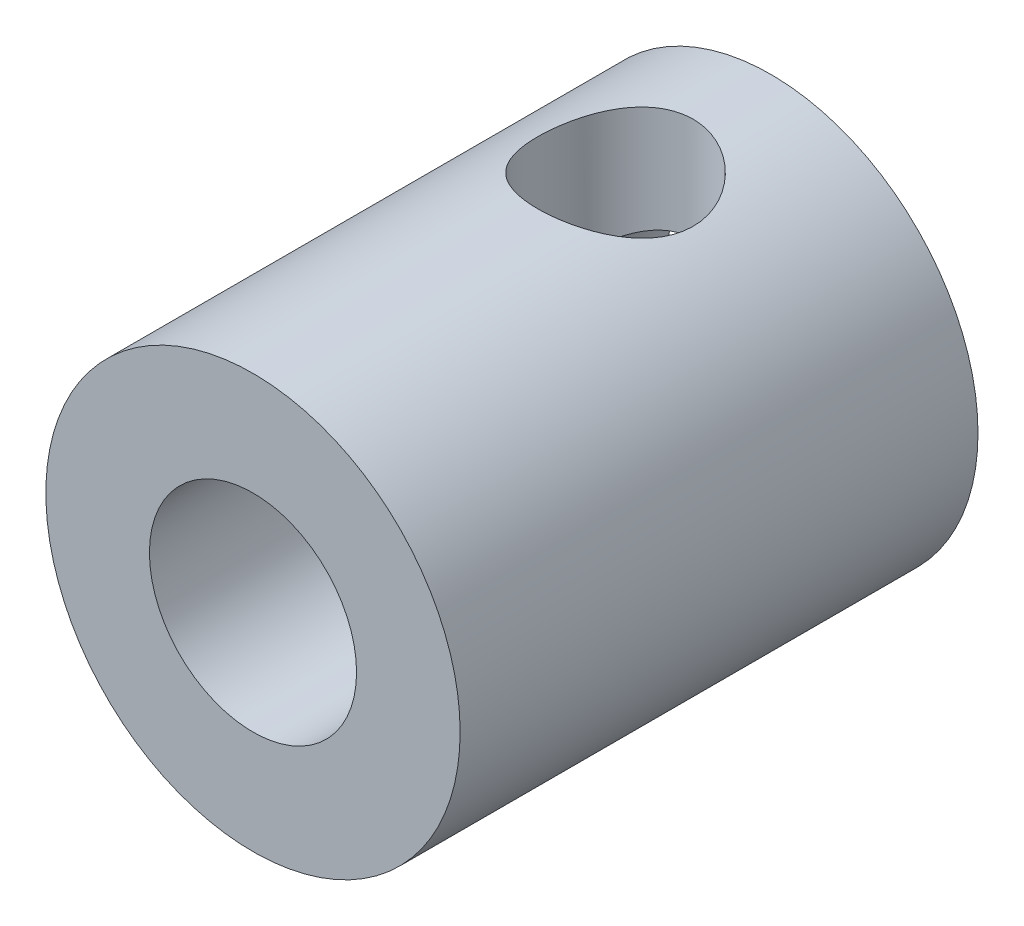
ISO-10303-21;
HEADER;
FILE_DESCRIPTION(('STEP AP214'),'2;1');
FILE_NAME('part.step','',(''),(''),'','','');
FILE_SCHEMA(('AUTOMOTIVE_DESIGN { 1 0 10303 214 1 1 1 1 }'));
ENDSEC;
DATA;
#1=APPLICATION_CONTEXT('core data for automotive mechanical design processes');
#2=APPLICATION_PROTOCOL_DEFINITION('international standard','automotive_design',2000,#1);
#3=PRODUCT_CONTEXT('',#1,'mechanical');
#4=PRODUCT('Part','Part','',(#3));
#5=PRODUCT_RELATED_PRODUCT_CATEGORY('part','',(#4));
#6=PRODUCT_DEFINITION_FORMATION('','',#4);
#7=PRODUCT_DEFINITION_CONTEXT('part definition',#1,'design');
#8=PRODUCT_DEFINITION('design','',#6,#7);
#9=PRODUCT_DEFINITION_SHAPE('','',#8);
#10=(LENGTH_UNIT() NAMED_UNIT(*) SI_UNIT(.MILLI.,.METRE.));
#11=(NAMED_UNIT(*) PLANE_ANGLE_UNIT() SI_UNIT($,.RADIAN.));
#12=(NAMED_UNIT(*) SI_UNIT($,.STERADIAN.) SOLID_ANGLE_UNIT());
#13=UNCERTAINTY_MEASURE_WITH_UNIT(LENGTH_MEASURE(1.E-05),#10,'distance_accuracy_value','');
#14=(GEOMETRIC_REPRESENTATION_CONTEXT(3) GLOBAL_UNCERTAINTY_ASSIGNED_CONTEXT((#13)) GLOBAL_UNIT_ASSIGNED_CONTEXT((#10,
#11,#12)) REPRESENTATION_CONTEXT('',''));
#15=CARTESIAN_POINT('',(0.,0.,0.));
#16=DIRECTION('',(0.,0.,1.));
#17=DIRECTION('',(1.,0.,0.));
#18=AXIS2_PLACEMENT_3D('',#15,#16,#17);
#19=CARTESIAN_POINT('',(0.,0.,50.));
#20=DIRECTION('',(0.,0.,-1.));
#21=DIRECTION('',(-1.,0.,0.));
#22=AXIS2_PLACEMENT_3D('',#19,#20,#21);
#23=CYLINDRICAL_SURFACE('',#22,20.);
#24=CARTESIAN_POINT('',(0.,0.,50.));
#25=DIRECTION('',(0.,0.,1.));
#26=DIRECTION('',(1.,0.,0.));
#27=AXIS2_PLACEMENT_3D('',#24,#25,#26);
#28=CIRCLE('',#27,20.);
#29=CARTESIAN_POINT('',(20.,0.,50.));
#30=VERTEX_POINT('',#29);
#31=EDGE_CURVE('E10',#30,#30,#28,.T.);
#32=ORIENTED_EDGE('',*,*,#31,.F.);
#33=EDGE_LOOP('',(#32));
#34=FACE_BOUND('',#33,.T.);
#35=CARTESIAN_POINT('',(0.,0.,0.));
#36=DIRECTION('',(0.,0.,1.));
#37=DIRECTION('',(1.,0.,0.));
#38=AXIS2_PLACEMENT_3D('',#35,#36,#37);
#39=CIRCLE('',#38,20.);
#40=CARTESIAN_POINT('',(20.,0.,0.));
#41=VERTEX_POINT('',#40);
#42=EDGE_CURVE('E55',#41,#41,#39,.T.);
#43=ORIENTED_EDGE('',*,*,#42,.T.);
#44=EDGE_LOOP('',(#43));
#45=FACE_BOUND('',#44,.T.);
#46=CARTESIAN_POINT('',(0.,20.,7.5));
#47=CARTESIAN_POINT('',(-0.203070968021456,20.0000006949911,7.49999905254471));
#48=CARTESIAN_POINT('',(-0.40612887203697,19.9969005176281,7.50825382526075));
#49=CARTESIAN_POINT('',(-0.810722493053339,19.9845861075051,7.54118522354036));
#50=CARTESIAN_POINT('',(-1.01225823948296,19.9753719932571,7.5658615307906));
#51=CARTESIAN_POINT('',(-1.41228165684715,19.9510804699548,7.63138175661786));
#52=CARTESIAN_POINT('',(-1.61076987270177,19.9360041221055,7.67222274902267));
#53=CARTESIAN_POINT('',(-2.00333465937662,19.9003893947718,7.76967818443338));
#54=CARTESIAN_POINT('',(-2.19741111301496,19.8798508703887,7.82629304588461));
#55=CARTESIAN_POINT('',(-2.57942334484994,19.8338980424643,7.95464043265563));
#56=CARTESIAN_POINT('',(-2.76737150814739,19.8084943914583,8.02633996223328));
#57=CARTESIAN_POINT('',(-3.13644330297231,19.7534187407954,8.18435364903087));
#58=CARTESIAN_POINT('',(-3.31756453344304,19.7237452567773,8.27067289049066));
#59=CARTESIAN_POINT('',(-3.67181392735243,19.6608785037209,8.45722898093484));
#60=CARTESIAN_POINT('',(-3.84494317652612,19.6276857148228,8.55746393196907));
#61=CARTESIAN_POINT('',(-4.18232397222971,19.5585744043947,8.77119114612923));
#62=CARTESIAN_POINT('',(-4.34657228246887,19.5226549005367,8.88468819508363));
#63=CARTESIAN_POINT('',(-4.67132012701298,19.4475600773382,9.12874957328976));
#64=CARTESIAN_POINT('',(-4.83143819793329,19.4083128458309,9.25979952141155));
#65=CARTESIAN_POINT('',(-5.14017756215578,19.328838303106,9.53453766314849));
#66=CARTESIAN_POINT('',(-5.28879851964384,19.2886109633058,9.6782262256576));
#67=CARTESIAN_POINT('',(-5.57375496212915,19.2082062022255,9.97745495362616));
#68=CARTESIAN_POINT('',(-5.71008474111935,19.1680288125827,10.1330005623441));
#69=CARTESIAN_POINT('',(-5.96951895886719,19.0888249186339,10.4549402891235));
#70=CARTESIAN_POINT('',(-6.09262784997175,19.0497980301105,10.6213307244897));
#71=CARTESIAN_POINT('',(-6.32936647954693,18.9724859555749,10.9706897102901));
#72=CARTESIAN_POINT('',(-6.44244711735878,18.9342875038848,11.1540502172022));
#73=CARTESIAN_POINT('',(-6.65263459332164,18.8614640429767,11.5302929428809));
#74=CARTESIAN_POINT('',(-6.74974783856142,18.826837602539,11.723171301916));
#75=CARTESIAN_POINT('',(-6.92721666163354,18.7622651010258,12.1172311413085));
#76=CARTESIAN_POINT('',(-7.00757383780173,18.732318593607,12.3184118275246));
#77=CARTESIAN_POINT('',(-7.15076659014489,18.6781264228347,12.7276608085247));
#78=CARTESIAN_POINT('',(-7.21360319410448,18.6538804250933,12.9357286984929));
#79=CARTESIAN_POINT('',(-7.3188864092305,18.6128171932609,13.3485176391735));
#80=CARTESIAN_POINT('',(-7.36206332770831,18.5957361566855,13.5530261968285));
#81=CARTESIAN_POINT('',(-7.43123437452077,18.5682025890409,13.9653728897456));
#82=CARTESIAN_POINT('',(-7.4572289440963,18.5577498877569,14.1732109393663));
#83=CARTESIAN_POINT('',(-7.49173666070089,18.5438461337811,14.5904932418232));
#84=CARTESIAN_POINT('',(-7.50025602352703,18.5403925915472,14.7999368969419));
#85=CARTESIAN_POINT('',(-7.49973228101478,18.5406045750876,15.2187944656479));
#86=CARTESIAN_POINT('',(-7.49068985687681,18.5442698247326,15.4282083800738));
#87=CARTESIAN_POINT('',(-7.45622070727224,18.5581541826773,15.8327523463325));
#88=CARTESIAN_POINT('',(-7.43181178035891,18.5679659887167,16.0279841783787));
#89=CARTESIAN_POINT('',(-7.36780931755873,18.5934550735589,16.4156228607984));
#90=CARTESIAN_POINT('',(-7.32821048574541,18.6091343980122,16.608028701577));
#91=CARTESIAN_POINT('',(-7.23421503229474,18.6458755071589,16.9886034776448));
#92=CARTESIAN_POINT('',(-7.17982236244592,18.6669358543613,17.176773529901));
#93=CARTESIAN_POINT('',(-7.05668780060369,18.7138316388318,17.5478194033523));
#94=CARTESIAN_POINT('',(-6.98794041903922,18.7396689024681,17.730693168571));
#95=CARTESIAN_POINT('',(-6.83525595221402,18.7959041471208,18.0933307976233));
#96=CARTESIAN_POINT('',(-6.75106109551285,18.8263777414694,18.2729743125707));
#97=CARTESIAN_POINT('',(-6.56896880176203,18.8906847573172,18.6246197275464));
#98=CARTESIAN_POINT('',(-6.47106670768666,18.9245193195636,18.7966190041746));
#99=CARTESIAN_POINT('',(-6.26222988156311,18.9946467838013,19.1320100053651));
#100=CARTESIAN_POINT('',(-6.1512936895239,19.0309399609969,19.295400762685));
#101=CARTESIAN_POINT('',(-5.91707432475698,19.1050600058862,19.6127131494869));
#102=CARTESIAN_POINT('',(-5.79379059406597,19.1428869428418,19.7666343505488));
#103=CARTESIAN_POINT('',(-5.52685758549758,19.2217192251952,20.0742548826265));
#104=CARTESIAN_POINT('',(-5.38239554850841,19.2627668694648,20.2272390814045));
#105=CARTESIAN_POINT('',(-5.08111960259878,19.3444196466276,20.5205444429057));
#106=CARTESIAN_POINT('',(-4.92430945357669,19.3850249099682,20.6608694325439));
#107=CARTESIAN_POINT('',(-4.59913178437367,19.4647378562275,20.9280937220137));
#108=CARTESIAN_POINT('',(-4.43075815242739,19.5038447299098,21.0549858305757));
#109=CARTESIAN_POINT('',(-4.08359626326275,19.5794735643872,21.2943367780478));
#110=CARTESIAN_POINT('',(-3.90481219826151,19.6159965527517,21.4068013691849));
#111=CARTESIAN_POINT('',(-3.53492899562548,19.6860423205742,21.6181847048906));
#112=CARTESIAN_POINT('',(-3.34367879554688,19.7195078794209,21.7168584703996));
#113=CARTESIAN_POINT('',(-2.95285527289817,19.7818042347176,21.8976065846665));
#114=CARTESIAN_POINT('',(-2.75328550625454,19.8106369862409,21.9796879393182));
#115=CARTESIAN_POINT('',(-2.34719996217688,19.8628434264484,22.1265180706344));
#116=CARTESIAN_POINT('',(-2.14068515604437,19.8862178749036,22.1912692597627));
#117=CARTESIAN_POINT('',(-1.72226565642152,19.9268153054777,22.3027850737005));
#118=CARTESIAN_POINT('',(-1.5103612863393,19.9440386557731,22.3495507750518));
#119=CARTESIAN_POINT('',(-1.09424775972726,19.9710730258303,22.4225900452183));
#120=CARTESIAN_POINT('',(-0.890228709079153,19.9812295417902,22.4498211771227));
#121=CARTESIAN_POINT('',(-0.480429861153435,19.9952797490968,22.487424053648));
#122=CARTESIAN_POINT('',(-0.274650126591161,19.9991736625905,22.4977963962844));
#123=CARTESIAN_POINT('',(0.137045616648894,20.0005896492051,22.501572423763));
#124=CARTESIAN_POINT('',(0.34296159098993,19.9981129628774,22.4949794122809));
#125=CARTESIAN_POINT('',(0.753379848819877,19.9868596574388,22.4649014511288));
#126=CARTESIAN_POINT('',(0.957882153780112,19.9780831342252,22.4414167585874));
#127=CARTESIAN_POINT('',(1.35605980169529,19.9549324504254,22.3790331468373));
#128=CARTESIAN_POINT('',(1.54984794134558,19.9407879695859,22.3407656747715));
#129=CARTESIAN_POINT('',(1.93344269290831,19.9072569807347,22.2491858797098));
#130=CARTESIAN_POINT('',(2.12324787732371,19.887868626756,22.1958682584174));
#131=CARTESIAN_POINT('',(2.49752579570186,19.8443406080703,22.0746766038757));
#132=CARTESIAN_POINT('',(2.68200002602577,19.8202022917965,22.0068067012819));
#133=CARTESIAN_POINT('',(3.04461799000738,19.7677484774414,21.8570256010086));
#134=CARTESIAN_POINT('',(3.22275928941149,19.7394313942141,21.7751090730554));
#135=CARTESIAN_POINT('',(3.57668241852781,19.6784277420874,21.5952919933077));
#136=CARTESIAN_POINT('',(3.75224591151486,19.6456382523032,21.4969967123145));
#137=CARTESIAN_POINT('',(4.09456511700747,19.5771555886676,21.2868820687758));
#138=CARTESIAN_POINT('',(4.26131777525405,19.5414614186652,21.1750580601418));
#139=CARTESIAN_POINT('',(4.58506525872597,19.4680439258145,20.9386328397494));
#140=CARTESIAN_POINT('',(4.74205864972659,19.4303203062301,20.814029757071));
#141=CARTESIAN_POINT('',(5.04542669379827,19.3537631643409,20.552813720806));
#142=CARTESIAN_POINT('',(5.19180095855238,19.3149296015203,20.4162003284339));
#143=CARTESIAN_POINT('',(5.4813462403016,19.2348304666649,20.1234421885064));
#144=CARTESIAN_POINT('',(5.6238337222247,19.1935550246388,19.9666232257584));
#145=CARTESIAN_POINT('',(5.89510225689366,19.1119813103232,19.6414001876497));
#146=CARTESIAN_POINT('',(6.02388768732425,19.071682729132,19.4729998409202));
#147=CARTESIAN_POINT('',(6.26701151435385,18.9931802921809,19.1254765836214));
#148=CARTESIAN_POINT('',(6.38134264929434,18.9549774947293,18.9463483495654));
#149=CARTESIAN_POINT('',(6.59459943128485,18.881842233177,18.5786052802664));
#150=CARTESIAN_POINT('',(6.6935315561577,18.8469083964192,18.3899944784229));
#151=CARTESIAN_POINT('',(6.87566403749447,18.7812317544014,18.0035125318189));
#152=CARTESIAN_POINT('',(6.95878910381582,18.7505091923228,17.8056024054855));
#153=CARTESIAN_POINT('',(7.10793535121495,18.694480634226,17.4027815202422));
#154=CARTESIAN_POINT('',(7.1739637009929,18.6691723687546,17.1978737363964));
#155=CARTESIAN_POINT('',(7.28826820106416,18.6248465673625,16.7825594582109));
#156=CARTESIAN_POINT('',(7.33654974112424,18.6058271216825,16.572154654162));
#157=CARTESIAN_POINT('',(7.41484504718195,18.5747639414794,16.1474688125651));
#158=CARTESIAN_POINT('',(7.44486008725789,18.5627197204411,15.9331880464369));
#159=CARTESIAN_POINT('',(7.48493863022116,18.5465933049917,15.516399006473));
#160=CARTESIAN_POINT('',(7.4961604056798,18.5420491539834,15.3140191987622));
#161=CARTESIAN_POINT('',(7.5021819174978,18.5396138019941,14.9089775659615));
#162=CARTESIAN_POINT('',(7.49698220177711,18.5417223790381,14.7063157505067));
#163=CARTESIAN_POINT('',(7.4702189157973,18.5525209844085,14.3022758039112));
#164=CARTESIAN_POINT('',(7.44865693372293,18.5612103739758,14.100897550096));
#165=CARTESIAN_POINT('',(7.38940016534893,18.5848804234321,13.7009073892477));
#166=CARTESIAN_POINT('',(7.35170539028268,18.5998610789405,13.5022954802885));
#167=CARTESIAN_POINT('',(7.26196897505607,18.6350757989785,13.1153148504017));
#168=CARTESIAN_POINT('',(7.21040468493112,18.655133955521,12.926819015639));
#169=CARTESIAN_POINT('',(7.09291899633679,18.7001191111151,12.55489240608));
#170=CARTESIAN_POINT('',(7.02699287074366,18.7250477129692,12.3714633214304));
#171=CARTESIAN_POINT('',(6.8813305560967,18.7790659217203,12.0108379094896));
#172=CARTESIAN_POINT('',(6.80159661292323,18.8081548517944,11.8336405742171));
#173=CARTESIAN_POINT('',(6.62889488784757,18.8697152850299,11.4863969945344));
#174=CARTESIAN_POINT('',(6.53592197197538,18.9021880991186,11.3163535576455));
#175=CARTESIAN_POINT('',(6.2277137240126,19.0069536143875,10.8010729091877));
#176=CARTESIAN_POINT('',(5.99071861556498,19.0836670851801,10.4694346800832));
#177=CARTESIAN_POINT('',(5.46664728657928,19.2403301804045,9.84920350283914));
#178=CARTESIAN_POINT('',(5.17955514905406,19.3202808271434,9.56062428976864));
#179=CARTESIAN_POINT('',(4.7080940863324,19.438676663767,9.1579298192362));
#180=CARTESIAN_POINT('',(4.53926103129734,19.4788882496359,9.02579433025875));
#181=CARTESIAN_POINT('',(4.19055225393182,19.55686920485,8.776240263987));
#182=CARTESIAN_POINT('',(4.01068067682134,19.5946394801554,8.65881621198339));
#183=CARTESIAN_POINT('',(3.6409088062972,19.6667051020052,8.43951031488935));
#184=CARTESIAN_POINT('',(3.45100321297443,19.7009985836445,8.33763679623718));
#185=CARTESIAN_POINT('',(3.06258638682355,19.7651027001156,8.15039996600227));
#186=CARTESIAN_POINT('',(2.86407884437145,19.7949152332913,8.06502965845989));
#187=CARTESIAN_POINT('',(2.45094825989374,19.8503942615567,7.90818968864652));
#188=CARTESIAN_POINT('',(2.23600002200006,19.8758228421911,7.83748988226127));
#189=CARTESIAN_POINT('',(1.79994016793749,19.9200461241093,7.71567009013676));
#190=CARTESIAN_POINT('',(1.57882824303678,19.9388404924467,7.66455108707419));
#191=CARTESIAN_POINT('',(1.13248745661206,19.969163307367,7.58252489103568));
#192=CARTESIAN_POINT('',(0.907260367875011,19.9806948101893,7.55160919623015));
#193=CARTESIAN_POINT('',(0.454683233786639,19.9961123363293,7.51034844111116));
#194=CARTESIAN_POINT('',(0.227333430788378,19.9999992219729,7.50000106065512));
#195=CARTESIAN_POINT('',(0.,20.,7.5));
#196=B_SPLINE_CURVE_WITH_KNOTS('',3,(#46,#47,#48,#49,#50,#51,#52,#53,#54,#55,#56,#57,#58,#59,
#60,#61,#62,#63,#64,#65,#66,#67,#68,#69,#70,#71,#72,#73,#74,#75,#76,#77,#78,#79,#80,#81,#82,#83,
#84,#85,#86,#87,#88,#89,#90,#91,#92,#93,#94,#95,#96,#97,#98,#99,#100,#101,#102,#103,#104,#105,
#106,#107,#108,#109,#110,#111,#112,#113,#114,#115,#116,#117,#118,#119,#120,#121,#122,#123,#124,
#125,#126,#127,#128,#129,#130,#131,#132,#133,#134,#135,#136,#137,#138,#139,#140,#141,#142,#143,
#144,#145,#146,#147,#148,#149,#150,#151,#152,#153,#154,#155,#156,#157,#158,#159,#160,#161,#162,
#163,#164,#165,#166,#167,#168,#169,#170,#171,#172,#173,#174,#175,#176,#177,#178,#179,#180,#181,
#182,#183,#184,#185,#186,#187,#188,#189,#190,#191,#192,#193,#194,#195),.UNSPECIFIED.,.T.,.F.,(4,
2,2,2,2,2,2,2,2,2,2,2,2,2,2,2,2,2,2,2,2,2,2,2,2,2,2,2,2,2,2,2,2,2,2,2,2,2,2,2,2,2,2,2,2,2,2,2,2,
2,2,2,2,2,2,2,2,2,2,2,2,2,2,2,2,2,2,2,2,2,2,2,2,2,4),(0.,0.608999956569121,1.2179881086895,
1.82686607061669,2.43576018624771,3.04333602101901,3.65112358554748,4.25882833580728,
4.86675306673733,5.49784759802492,6.12896055572049,6.76036500614003,7.39155614970224,
8.04710389078631,8.70238794089192,9.35760945582952,10.0127925263413,10.6411154155012,
11.2694221687695,11.8975053993619,12.5255642678541,13.1158609555577,13.706363636216,
14.2967087341194,14.8872800083734,15.48879042923,16.0905057110534,16.6922884573043,
17.2940984093271,17.9364976383173,18.5787020128302,19.2212484699716,19.8635379434159,
20.5160836111604,21.1683531732238,21.8205318881423,22.4726715600923,23.0901283371345,
23.7075632112555,24.3248778609402,24.9421831139336,25.5356078324119,26.129241722893,
26.7227073333315,27.3163986465876,27.9273114640636,28.5384346823473,29.149647500183,
29.760882657408,30.407730978247,31.0543720122049,31.7013366304338,32.3480283535228,
32.9977271255338,33.647153034297,34.2963815469097,34.9455647710003,35.5530262644448,
36.1604674895258,36.7678497615569,37.375231610664,37.96391674576,38.5527959370655,
39.1415794353244,39.7305918841889,40.9691711455771,42.2081446512166,42.8618687687023,
43.5153488822951,44.169177679639,44.8227286983722,45.5048205241399,46.186946576693,
46.8687853960765,47.5505472984583),.UNSPECIFIED.);
#197=CARTESIAN_POINT('',(0.,20.,7.5));
#198=VERTEX_POINT('',#197);
#199=EDGE_CURVE('E67',#198,#198,#196,.T.);
#200=ORIENTED_EDGE('',*,*,#199,.F.);
#201=EDGE_LOOP('',(#200));
#202=FACE_BOUND('',#201,.T.);
#203=ADVANCED_FACE('F41',(#34,#45,#202),#23,.T.);
#204=CARTESIAN_POINT('',(0.,0.,50.));
#205=DIRECTION('',(0.,0.,-1.));
#206=DIRECTION('',(-1.,0.,0.));
#207=AXIS2_PLACEMENT_3D('',#204,#205,#206);
#208=CYLINDRICAL_SURFACE('',#207,10.);
#209=CARTESIAN_POINT('',(0.,0.,0.));
#210=DIRECTION('',(0.,0.,1.));
#211=DIRECTION('',(1.,0.,0.));
#212=AXIS2_PLACEMENT_3D('',#209,#210,#211);
#213=CIRCLE('',#212,10.);
#214=CARTESIAN_POINT('',(10.,0.,0.));
#215=VERTEX_POINT('',#214);
#216=EDGE_CURVE('E63',#215,#215,#213,.T.);
#217=ORIENTED_EDGE('',*,*,#216,.F.);
#218=EDGE_LOOP('',(#217));
#219=FACE_BOUND('',#218,.T.);
#220=CARTESIAN_POINT('',(0.,0.,50.));
#221=DIRECTION('',(0.,0.,1.));
#222=DIRECTION('',(1.,0.,0.));
#223=AXIS2_PLACEMENT_3D('',#220,#221,#222);
#224=CIRCLE('',#223,10.);
#225=CARTESIAN_POINT('',(10.,0.,50.));
#226=VERTEX_POINT('',#225);
#227=EDGE_CURVE('E61',#226,#226,#224,.T.);
#228=ORIENTED_EDGE('',*,*,#227,.T.);
#229=EDGE_LOOP('',(#228));
#230=FACE_BOUND('',#229,.T.);
#231=CARTESIAN_POINT('',(0.,10.,7.5));
#232=CARTESIAN_POINT('',(-0.183148360631223,9.99999825220043,7.50000181106261));
#233=CARTESIAN_POINT('',(-0.366342585140462,9.99495621731441,7.50672095644631));
#234=CARTESIAN_POINT('',(-0.731284647804645,9.97490143097507,7.5334924645278));
#235=CARTESIAN_POINT('',(-0.913031554599343,9.95988271339075,7.55355280536876));
#236=CARTESIAN_POINT('',(-1.27389276294164,9.9201917868147,7.60672475330212));
#237=CARTESIAN_POINT('',(-1.45300136929127,9.89550118322144,7.63986123030484));
#238=CARTESIAN_POINT('',(-1.80698937268239,9.83702172640045,7.71867503216433));
#239=CARTESIAN_POINT('',(-1.98186684397495,9.80322881221236,7.76435795474781));
#240=CARTESIAN_POINT('',(-2.32506995293138,9.72752378128582,7.86726367830834));
#241=CARTESIAN_POINT('',(-2.49343113760904,9.6856665671512,7.92440854751618));
#242=CARTESIAN_POINT('',(-2.82395570771372,9.59451489400363,8.04970833708236));
#243=CARTESIAN_POINT('',(-2.98611660943024,9.5452174929203,8.11786761362111));
#244=CARTESIAN_POINT('',(-3.46192400316672,9.38756843011347,8.33764786702261));
#245=CARTESIAN_POINT('',(-3.76534217699647,9.2693577301146,8.50470784255644));
#246=CARTESIAN_POINT('',(-4.36738031046613,9.00247083181558,8.89132929284911));
#247=CARTESIAN_POINT('',(-4.66295396944976,8.85198712189838,9.11431999491101));
#248=CARTESIAN_POINT('',(-5.21514803427101,8.53832916588274,9.59749586451611));
#249=CARTESIAN_POINT('',(-5.47170701559805,8.37513550772825,9.85773845612116));
#250=CARTESIAN_POINT('',(-5.84983236323795,8.11230548493661,10.3013392482352));
#251=CARTESIAN_POINT('',(-5.98448699541009,8.01322272061778,10.4740761780575));
#252=CARTESIAN_POINT('',(-6.23870842573754,7.81692237304354,10.8314719297562));
#253=CARTESIAN_POINT('',(-6.35827067422417,7.71970535968098,11.0161343213796));
#254=CARTESIAN_POINT('',(-6.58155279088788,7.53024443396408,11.396971137314));
#255=CARTESIAN_POINT('',(-6.68528849377295,7.43799561146134,11.5931337797153));
#256=CARTESIAN_POINT('',(-6.87611265864527,7.26194992595442,11.9968429179122));
#257=CARTESIAN_POINT('',(-6.96321059804277,7.17814826410122,12.2043828455971));
#258=CARTESIAN_POINT('',(-7.14400878104046,6.99885956719935,12.6974535476118));
#259=CARTESIAN_POINT('',(-7.23130376139035,6.9078729915952,12.9871290180054));
#260=CARTESIAN_POINT('',(-7.33616747091051,6.79582705692467,13.4334697239536));
#261=CARTESIAN_POINT('',(-7.36676563602348,6.76256264952771,13.5841326866528));
#262=CARTESIAN_POINT('',(-7.41882486802788,6.70541097180997,13.8887516684623));
#263=CARTESIAN_POINT('',(-7.44029064361234,6.68151886959137,14.0427059474463));
#264=CARTESIAN_POINT('',(-7.47381957747949,6.64399487351841,14.3543846726693));
#265=CARTESIAN_POINT('',(-7.48579180837431,6.63046224230685,14.5121310121069));
#266=CARTESIAN_POINT('',(-7.49971481213818,6.61471013710175,14.8286335771239));
#267=CARTESIAN_POINT('',(-7.50166585998078,6.61249035269245,14.9873897748738));
#268=CARTESIAN_POINT('',(-7.49549374588534,6.61948621008002,15.3045070458082));
#269=CARTESIAN_POINT('',(-7.48736728681514,6.62870559451458,15.4628679726797));
#270=CARTESIAN_POINT('',(-7.46124382754021,6.65809333447629,15.7777067944034));
#271=CARTESIAN_POINT('',(-7.44324672677111,6.6782618015552,15.934184670054));
#272=CARTESIAN_POINT('',(-7.37988631197293,6.74840995476557,16.3657496870096));
#273=CARTESIAN_POINT('',(-7.32413018954154,6.80936438102533,16.6376055670218));
#274=CARTESIAN_POINT('',(-7.18527767988214,6.95570310792853,17.1672707552838));
#275=CARTESIAN_POINT('',(-7.10215501424415,7.04111087930064,17.4250662838031));
#276=CARTESIAN_POINT('',(-6.92917382263755,7.21099153900677,17.8781694832614));
#277=CARTESIAN_POINT('',(-6.84346833605324,7.29266351327928,18.0761594238641));
#278=CARTESIAN_POINT('',(-6.65682611972849,7.46342165901279,18.46158098312));
#279=CARTESIAN_POINT('',(-6.55588157861578,7.55251162228971,18.6490071188232));
#280=CARTESIAN_POINT('',(-6.33933222593356,7.73517823120313,19.0134638359849));
#281=CARTESIAN_POINT('',(-6.22369741624747,7.82876380678446,19.1904720297294));
#282=CARTESIAN_POINT('',(-5.97844426893635,8.01761553681547,19.5335028841527));
#283=CARTESIAN_POINT('',(-5.84882812374302,8.11288142581883,19.6995272606499));
#284=CARTESIAN_POINT('',(-5.57247402890015,8.30521453319946,20.024354951916));
#285=CARTESIAN_POINT('',(-5.42538639972571,8.40226649936021,20.1828700952384));
#286=CARTESIAN_POINT('',(-5.11709028531975,8.5935031315706,20.4874712931344));
#287=CARTESIAN_POINT('',(-4.95588037331081,8.68768750660852,20.6335560889212));
#288=CARTESIAN_POINT('',(-4.61993509999966,8.87089324795422,20.9121685815808));
#289=CARTESIAN_POINT('',(-4.44522309293499,8.9599230830712,21.0447188059507));
#290=CARTESIAN_POINT('',(-4.08249343487889,9.13090472642982,21.2953804981527));
#291=CARTESIAN_POINT('',(-3.89447920193418,9.21285834099645,21.4134956539972));
#292=CARTESIAN_POINT('',(-3.54483535127364,9.35211813533672,21.6118106225478));
#293=CARTESIAN_POINT('',(-3.38547499880139,9.41107137526017,21.6948639787926));
#294=CARTESIAN_POINT('',(-3.05924910859918,9.52211460031246,21.8500808784182));
#295=CARTESIAN_POINT('',(-2.89238512327235,9.57420599638373,21.9222466609628));
#296=CARTESIAN_POINT('',(-2.55192522953365,9.67052015896568,22.0548590763305));
#297=CARTESIAN_POINT('',(-2.37833187059297,9.71474587063951,22.1153100962974));
#298=CARTESIAN_POINT('',(-2.02530797337889,9.7944303324846,22.2237259983825));
#299=CARTESIAN_POINT('',(-1.84587736017291,9.82988897006302,22.2716907201434));
#300=CARTESIAN_POINT('',(-1.4812400399979,9.89142668215868,22.3546653228274));
#301=CARTESIAN_POINT('',(-1.29600425567114,9.91744578882848,22.3895924169133));
#302=CARTESIAN_POINT('',(-0.922276966538728,9.95915423278582,22.4454751063309));
#303=CARTESIAN_POINT('',(-0.733785453806573,9.97484354492046,22.4664306676423));
#304=CARTESIAN_POINT('',(-0.355230498112974,9.99548555303477,22.4939852447411));
#305=CARTESIAN_POINT('',(-0.165167600582659,10.0004418293711,22.5005890480314));
#306=CARTESIAN_POINT('',(0.214874139571328,9.99949640206274,22.4993285937768));
#307=CARTESIAN_POINT('',(0.404852987638425,9.99359555401241,22.4914654762959));
#308=CARTESIAN_POINT('',(0.763928127056934,9.97223305994797,22.4629423697379));
#309=CARTESIAN_POINT('',(0.933197305435497,9.9577961888837,22.4436536580073));
#310=CARTESIAN_POINT('',(1.26918880187072,9.92057133553495,22.393781950484));
#311=CARTESIAN_POINT('',(1.43591025146063,9.89778056893783,22.36319518908));
#312=CARTESIAN_POINT('',(1.76564432096827,9.84430767733922,22.2911573494213));
#313=CARTESIAN_POINT('',(1.92865783628606,9.81362747999547,22.2497089249952));
#314=CARTESIAN_POINT('',(2.2501682264863,9.74493618777163,22.1564499227148));
#315=CARTESIAN_POINT('',(2.40866330572277,9.70692222377835,22.1046352891018));
#316=CARTESIAN_POINT('',(2.72575422161848,9.62279034107677,21.9892566436357));
#317=CARTESIAN_POINT('',(2.88416117889077,9.57643622072002,21.9253461741077));
#318=CARTESIAN_POINT('',(3.19463271777295,9.47738924248976,21.7877229490928));
#319=CARTESIAN_POINT('',(3.34669511976836,9.42469423001767,21.714006860811));
#320=CARTESIAN_POINT('',(3.79243668836606,9.25839398463923,21.4792069241768));
#321=CARTESIAN_POINT('',(4.07590942242921,9.13650809547068,21.3043830298445));
#322=CARTESIAN_POINT('',(4.65763303463209,8.855926898612,20.8910388757337));
#323=CARTESIAN_POINT('',(4.95044606090117,8.69448369509785,20.6467569844664));
#324=CARTESIAN_POINT('',(5.35767107336567,8.44516881462101,20.2517852965719));
#325=CARTESIAN_POINT('',(5.4882491820926,8.36074234741944,20.1151472141623));
#326=CARTESIAN_POINT('',(5.7384834596805,8.19100904652955,19.8327407122706));
#327=CARTESIAN_POINT('',(5.85814221058999,8.1057024263051,19.6869744651008));
#328=CARTESIAN_POINT('',(6.1080614484982,7.91961196391862,19.3579836003852));
#329=CARTESIAN_POINT('',(6.23600392340882,7.81897317293293,19.1729105765988));
#330=CARTESIAN_POINT('',(6.47564568677309,7.62168627596285,18.7903779523481));
#331=CARTESIAN_POINT('',(6.58733900727103,7.52503964549598,18.5929138388307));
#332=CARTESIAN_POINT('',(6.79334858159908,7.33958950470875,18.1862601442869));
#333=CARTESIAN_POINT('',(6.88770568215122,7.25076782174859,17.9770996801148));
#334=CARTESIAN_POINT('',(7.05807032553021,7.08503810393456,17.546968719068));
#335=CARTESIAN_POINT('',(7.13409308112477,7.00812021113291,17.3260082004461));
#336=CARTESIAN_POINT('',(7.24045739920368,6.89776536900087,16.9612634200972));
#337=CARTESIAN_POINT('',(7.27706722475707,6.85905105065738,16.820878649422));
#338=CARTESIAN_POINT('',(7.34237828490354,6.789092156193,16.536473432307));
#339=CARTESIAN_POINT('',(7.37108229544016,6.75784495867726,16.3924542814349));
#340=CARTESIAN_POINT('',(7.42010866141178,6.70397772845789,16.1016728535583));
#341=CARTESIAN_POINT('',(7.4404465075322,6.68134175721603,15.9549161770611));
#342=CARTESIAN_POINT('',(7.47244433482207,6.64553659947693,15.6592977877309));
#343=CARTESIAN_POINT('',(7.4841042940654,6.63236743689916,15.51043606958));
#344=CARTESIAN_POINT('',(7.49853887636308,6.61604392687071,15.2109543865269));
#345=CARTESIAN_POINT('',(7.50126737026041,6.61294157310428,15.0603293133359));
#346=CARTESIAN_POINT('',(7.49764855771467,6.61704410383112,14.7593349289988));
#347=CARTESIAN_POINT('',(7.491301442004,6.6242487717127,14.608965612544));
#348=CARTESIAN_POINT('',(7.46966150960367,6.64864042221955,14.30955966116));
#349=CARTESIAN_POINT('',(7.45436050750457,6.66583653866429,14.1605243725003));
#350=CARTESIAN_POINT('',(7.41510828933917,6.70947271822503,13.8649129627447));
#351=CARTESIAN_POINT('',(7.39115248495673,6.73591768435147,13.718338189297));
#352=CARTESIAN_POINT('',(7.32888993758964,6.80366991769713,13.3969814369498));
#353=CARTESIAN_POINT('',(7.28859466709028,6.84695911424574,13.2230024385485));
#354=CARTESIAN_POINT('',(7.19657956576836,6.94360749633832,12.8808805847487));
#355=CARTESIAN_POINT('',(7.14485111212704,6.99697427787176,12.7127422456765));
#356=CARTESIAN_POINT('',(7.03063417120002,7.11173285585202,12.3826051555682));
#357=CARTESIAN_POINT('',(6.96812436806886,7.17314049085418,12.2206193579992));
#358=CARTESIAN_POINT('',(6.83308175773697,7.30189696957417,11.9034373582543));
#359=CARTESIAN_POINT('',(6.76055200457875,7.36924400073342,11.7482391061653));
#360=CARTESIAN_POINT('',(6.57908862155701,7.53227527340475,11.3919144076399));
#361=CARTESIAN_POINT('',(6.46625899136202,7.62967949604614,11.1935510403099));
#362=CARTESIAN_POINT('',(6.22409397674892,7.82848797542238,10.8092656082297));
#363=CARTESIAN_POINT('',(6.09475344941421,7.92989347166994,10.6233474476133));
#364=CARTESIAN_POINT('',(5.82000166017292,8.13368678615596,10.2641001824866));
#365=CARTESIAN_POINT('',(5.67457836362909,8.23607528693576,10.0907806683932));
#366=CARTESIAN_POINT('',(5.36811116429771,8.43902615179917,9.75742106763493));
#367=CARTESIAN_POINT('',(5.20706915992245,8.53958873605844,9.59737937146329));
#368=CARTESIAN_POINT('',(4.86823444610667,8.73722404742755,9.29009342782365));
#369=CARTESIAN_POINT('',(4.69031229919782,8.83426032912376,9.1429680758643));
#370=CARTESIAN_POINT('',(4.31926384766125,9.02148209885813,8.86422000820311));
#371=CARTESIAN_POINT('',(4.12613556060168,9.11166669061666,8.73259931945357));
#372=CARTESIAN_POINT('',(3.72576429558786,9.28256253574139,8.48664683473564));
#373=CARTESIAN_POINT('',(3.51854917893225,9.36329167565035,8.37228227378446));
#374=CARTESIAN_POINT('',(3.09083237545736,9.51304471510835,8.16235194822691));
#375=CARTESIAN_POINT('',(2.87033762289901,9.5820746530538,8.06677648176524));
#376=CARTESIAN_POINT('',(2.48412405824607,9.68796526126722,7.9212735772535));
#377=CARTESIAN_POINT('',(2.32129005811084,9.72832482945904,7.86617700851184));
#378=CARTESIAN_POINT('',(1.9906420118458,9.80132549603499,7.76694296017011));
#379=CARTESIAN_POINT('',(1.82282918610053,9.83396846856479,7.72280281942897));
#380=CARTESIAN_POINT('',(1.48358839494539,9.89082818213227,7.64614790452321));
#381=CARTESIAN_POINT('',(1.31216977477245,9.91506439962452,7.61360625452351));
#382=CARTESIAN_POINT('',(0.966540401338079,9.95469855719796,7.56048804100351));
#383=CARTESIAN_POINT('',(0.792331122875265,9.9701010169854,7.53990535872308));
#384=CARTESIAN_POINT('',(0.514835906933089,9.98726751877774,7.51698319841702));
#385=CARTESIAN_POINT('',(0.412044960462379,9.99203792739739,7.51061884813289));
#386=CARTESIAN_POINT('',(0.206174215981062,9.9984049153868,7.50212639822716));
#387=CARTESIAN_POINT('',(0.103094374145229,10.0000009838379,7.49999898055125));
#388=CARTESIAN_POINT('',(0.,10.,7.5));
#389=B_SPLINE_CURVE_WITH_KNOTS('',3,(#231,#232,#233,#234,#235,#236,#237,#238,#239,#240,#241,
#242,#243,#244,#245,#246,#247,#248,#249,#250,#251,#252,#253,#254,#255,#256,#257,#258,#259,#260,
#261,#262,#263,#264,#265,#266,#267,#268,#269,#270,#271,#272,#273,#274,#275,#276,#277,#278,#279,
#280,#281,#282,#283,#284,#285,#286,#287,#288,#289,#290,#291,#292,#293,#294,#295,#296,#297,#298,
#299,#300,#301,#302,#303,#304,#305,#306,#307,#308,#309,#310,#311,#312,#313,#314,#315,#316,#317,
#318,#319,#320,#321,#322,#323,#324,#325,#326,#327,#328,#329,#330,#331,#332,#333,#334,#335,#336,
#337,#338,#339,#340,#341,#342,#343,#344,#345,#346,#347,#348,#349,#350,#351,#352,#353,#354,#355,
#356,#357,#358,#359,#360,#361,#362,#363,#364,#365,#366,#367,#368,#369,#370,#371,#372,#373,#374,
#375,#376,#377,#378,#379,#380,#381,#382,#383,#384,#385,#386,#387,#388),.UNSPECIFIED.,.T.,.F.,(4,
2,2,2,2,2,2,2,2,2,2,2,2,2,2,2,2,2,2,2,2,2,2,2,2,2,2,2,2,2,2,2,2,2,2,2,2,2,2,2,2,2,2,2,2,2,2,2,2,
2,2,2,2,2,2,2,2,2,2,2,2,2,2,2,2,2,2,2,2,2,2,2,2,2,2,2,2,2,4),(0.,0.549333810396349,
1.09899642261334,1.64970953325451,2.20066875053375,2.74800168216963,3.29555161528971,
4.38923194166926,5.58419151329428,6.78101336768092,7.50152042078937,8.22224415798694,
8.94224200290019,9.6618284825884,10.6057257062582,11.0771415311411,11.5483139968762,
12.0239465220089,12.4995659960823,12.9753411231469,13.4511210976087,14.3000658907337,
15.1498282626302,15.8409837223713,16.5324946713612,17.2254411215001,17.9182790673241,
18.6286106705283,19.3390141216436,20.0482151836289,20.7572346715093,21.3240789510858,
21.8908064927599,22.4573213847599,23.0238435519584,23.5939042031105,24.163966242347,
24.733838089351,25.3036650295946,25.8159956353881,26.3284971539712,26.8408735696905,
27.3534508450853,27.8838865184232,28.4145029424249,29.4749536671179,30.7125000722884,
31.3331067040452,31.9535662015579,32.6921380168985,33.4309804122227,34.168059012369,
34.9045239072426,35.3546199278826,35.804557705681,36.2536585931601,36.7027606153631,
37.1541785263257,37.6055869504596,38.0574086864992,38.5094703067444,39.0599080061886,
39.610762266734,40.1627183763172,40.7145066214401,41.457880510944,42.2014865187519,
42.9456527762346,43.6897286953816,44.440059867972,45.1904890240893,45.9394748739468,
46.6880729590086,47.2172824489513,47.7463632763237,48.2742100312628,48.801786477061,
49.1109572068324,49.4201776944439),.UNSPECIFIED.);
#390=CARTESIAN_POINT('',(0.,10.,7.5));
#391=VERTEX_POINT('',#390);
#392=EDGE_CURVE('E45',#391,#391,#389,.T.);
#393=ORIENTED_EDGE('',*,*,#392,.T.);
#394=EDGE_LOOP('',(#393));
#395=FACE_BOUND('',#394,.T.);
#396=ADVANCED_FACE('F81',(#219,#230,#395),#208,.F.);
#397=CARTESIAN_POINT('',(0.,0.,50.));
#398=DIRECTION('',(0.,0.,1.));
#399=DIRECTION('',(1.,0.,0.));
#400=AXIS2_PLACEMENT_3D('',#397,#398,#399);
#401=PLANE('',#400);
#402=ORIENTED_EDGE('',*,*,#31,.T.);
#403=EDGE_LOOP('',(#402));
#404=FACE_BOUND('',#403,.T.);
#405=ORIENTED_EDGE('',*,*,#227,.F.);
#406=EDGE_LOOP('',(#405));
#407=FACE_BOUND('',#406,.T.);
#408=ADVANCED_FACE('F86',(#404,#407),#401,.T.);
#409=CARTESIAN_POINT('',(0.,0.,0.));
#410=DIRECTION('',(0.,0.,1.));
#411=DIRECTION('',(1.,0.,0.));
#412=AXIS2_PLACEMENT_3D('',#409,#410,#411);
#413=PLANE('',#412);
#414=ORIENTED_EDGE('',*,*,#42,.F.);
#415=EDGE_LOOP('',(#414));
#416=FACE_BOUND('',#415,.T.);
#417=ORIENTED_EDGE('',*,*,#216,.T.);
#418=EDGE_LOOP('',(#417));
#419=FACE_BOUND('',#418,.T.);
#420=ADVANCED_FACE('F79',(#416,#419),#413,.F.);
#421=CARTESIAN_POINT('',(0.,30.,15.));
#422=DIRECTION('',(0.,-1.,0.));
#423=DIRECTION('',(0.,0.,-1.));
#424=AXIS2_PLACEMENT_3D('',#421,#422,#423);
#425=CYLINDRICAL_SURFACE('',#424,7.5);
#426=ORIENTED_EDGE('',*,*,#392,.F.);
#427=EDGE_LOOP('',(#426));
#428=FACE_BOUND('',#427,.T.);
#429=ORIENTED_EDGE('',*,*,#199,.T.);
#430=EDGE_LOOP('',(#429));
#431=FACE_BOUND('',#430,.T.);
#432=ADVANCED_FACE('F76',(#428,#431),#425,.F.);
#433=CLOSED_SHELL('',(#203,#396,#408,#420,#432));
#434=MANIFOLD_SOLID_BREP('B2',#433);
#435=ADVANCED_BREP_SHAPE_REPRESENTATION('',(#18,#434),#14);
#436=SHAPE_DEFINITION_REPRESENTATION(#9,#435);
ENDSEC;
END-ISO-10303-21;
